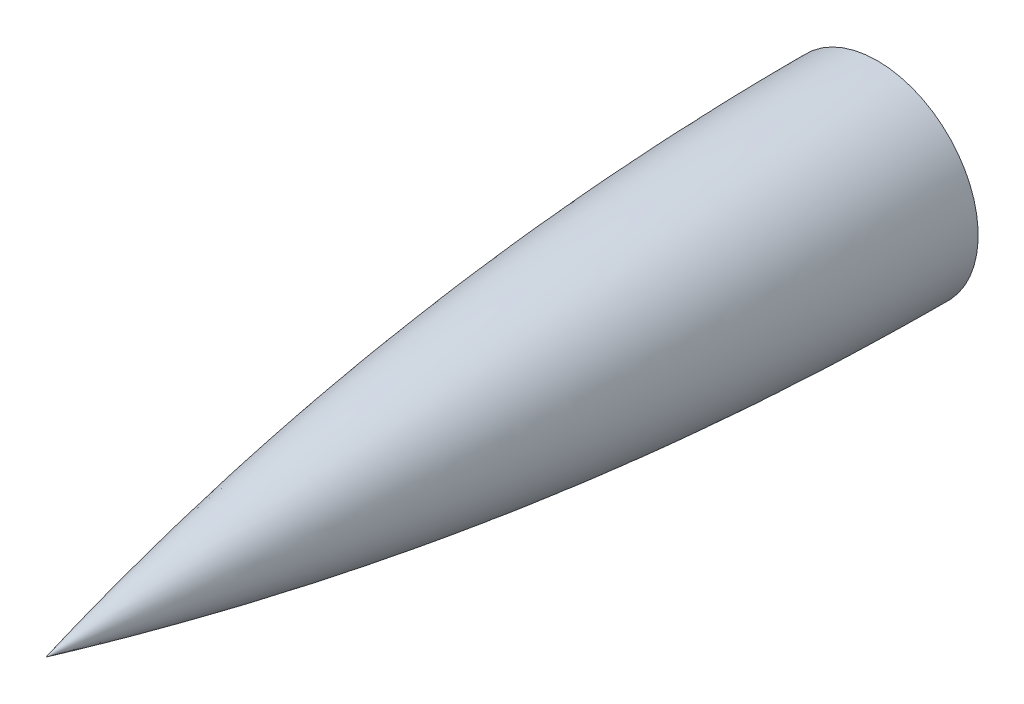
ISO-10303-21;
HEADER;
FILE_DESCRIPTION(('STEP AP214'),'2;1');
FILE_NAME('part.step','',(''),(''),'','','');
FILE_SCHEMA(('AUTOMOTIVE_DESIGN { 1 0 10303 214 1 1 1 1 }'));
ENDSEC;
DATA;
#1=APPLICATION_CONTEXT('core data for automotive mechanical design processes');
#2=APPLICATION_PROTOCOL_DEFINITION('international standard','automotive_design',2000,#1);
#3=PRODUCT_CONTEXT('',#1,'mechanical');
#4=PRODUCT('Part','Part','',(#3));
#5=PRODUCT_RELATED_PRODUCT_CATEGORY('part','',(#4));
#6=PRODUCT_DEFINITION_FORMATION('','',#4);
#7=PRODUCT_DEFINITION_CONTEXT('part definition',#1,'design');
#8=PRODUCT_DEFINITION('design','',#6,#7);
#9=PRODUCT_DEFINITION_SHAPE('','',#8);
#10=(LENGTH_UNIT() NAMED_UNIT(*) SI_UNIT(.MILLI.,.METRE.));
#11=(NAMED_UNIT(*) PLANE_ANGLE_UNIT() SI_UNIT($,.RADIAN.));
#12=(NAMED_UNIT(*) SI_UNIT($,.STERADIAN.) SOLID_ANGLE_UNIT());
#13=UNCERTAINTY_MEASURE_WITH_UNIT(LENGTH_MEASURE(1.E-05),#10,'distance_accuracy_value','');
#14=(GEOMETRIC_REPRESENTATION_CONTEXT(3) GLOBAL_UNCERTAINTY_ASSIGNED_CONTEXT((#13)) GLOBAL_UNIT_ASSIGNED_CONTEXT((#10,
#11,#12)) REPRESENTATION_CONTEXT('',''));
#15=CARTESIAN_POINT('',(0.,0.,0.));
#16=DIRECTION('',(0.,0.,1.));
#17=DIRECTION('',(1.,0.,0.));
#18=AXIS2_PLACEMENT_3D('',#15,#16,#17);
#19=CARTESIAN_POINT('',(0.,50.8000000000001,1.54988212495967E-13));
#20=CARTESIAN_POINT('',(0.,50.8,0.601365079538687));
#21=CARTESIAN_POINT('',(0.,50.7992106330532,1.81106682851214));
#22=CARTESIAN_POINT('',(0.,50.7956584817818,4.37340735369316));
#23=CARTESIAN_POINT('',(0.,50.7861860911781,7.23522524602849));
#24=CARTESIAN_POINT('',(0.,50.7719775372407,10.0726643367937));
#25=CARTESIAN_POINT('',(0.,50.7530328583311,12.9736184929585));
#26=CARTESIAN_POINT('',(0.,50.7293521055994,15.8531744296918));
#27=CARTESIAN_POINT('',(0.,50.7009353429816,18.7349387060777));
#28=CARTESIAN_POINT('',(0.,50.6676000436085,21.6333321527213));
#29=CARTESIAN_POINT('',(0.,50.6292589644624,24.5471865764733));
#30=CARTESIAN_POINT('',(0.,50.5749068032969,28.2132600767906));
#31=CARTESIAN_POINT('',(0.,50.4995086134746,32.6314834337387));
#32=CARTESIAN_POINT('',(0.,50.397117104975,37.7857849383283));
#33=CARTESIAN_POINT('',(0.,50.2603140212614,43.6760072358545));
#34=CARTESIAN_POINT('',(0.,50.0254353847092,52.5105872058537));
#35=CARTESIAN_POINT('',(0.,49.6937159982145,62.8159784935597));
#36=CARTESIAN_POINT('',(0.,48.433623126077,95.1967155084529));
#37=CARTESIAN_POINT('',(0.,44.8505008216617,152.540374475772));
#38=CARTESIAN_POINT('',(0.,38.8064209337679,211.179717997));
#39=CARTESIAN_POINT('',(0.,30.2760125789729,269.492204423295));
#40=CARTESIAN_POINT('',(0.,23.9689121299571,305.772427952917));
#41=CARTESIAN_POINT('',(0.,21.8597489130312,317.365763284394));
#42=CARTESIAN_POINT('',(0.,20.5090869147412,324.605615587789));
#43=CARTESIAN_POINT('',(0.,19.4091155854683,330.393813965379));
#44=CARTESIAN_POINT('',(0.,18.2896987871042,336.178329207407));
#45=CARTESIAN_POINT('',(0.,17.1508785393711,341.958976598366));
#46=CARTESIAN_POINT('',(0.,15.7030574989672,349.180103041335));
#47=CARTESIAN_POINT('',(0.,13.9269416840222,357.837358664998));
#48=CARTESIAN_POINT('',(0.,12.1022837932157,366.484976280109));
#49=CARTESIAN_POINT('',(0.,10.2294089945641,375.121587963031));
#50=CARTESIAN_POINT('',(0.,8.63625505883889,382.312547992372));
#51=CARTESIAN_POINT('',(0.,7.50450249754753,387.341006826934));
#52=CARTESIAN_POINT('',(0.,6.52167169986831,391.651205530606));
#53=CARTESIAN_POINT('',(0.,5.53772293048114,395.922569003378));
#54=CARTESIAN_POINT('',(0.,4.54831818546038,400.173762608327));
#55=CARTESIAN_POINT('',(0.,3.55788802846792,404.378328377264));
#56=CARTESIAN_POINT('',(0.,2.63137210748582,408.262170449303));
#57=CARTESIAN_POINT('',(0.,1.96401290205421,411.037356498978));
#58=CARTESIAN_POINT('',(0.,1.46234476068882,413.113503119476));
#59=CARTESIAN_POINT('',(0.,0.938981599428544,415.26791497626));
#60=CARTESIAN_POINT('',(0.,0.431955686333463,417.341057947048));
#61=CARTESIAN_POINT('',(0.,0.143674558299537,418.516049995998));
#62=CARTESIAN_POINT('',(0.,0.,419.099999999995));
#63=B_SPLINE_CURVE_WITH_KNOTS('',4,(#19,#20,#21,#22,#23,#24,#25,#26,#27,#28,#29,#30,#31,#32,#33,
#34,#35,#36,#37,#38,#39,#40,#41,#42,#43,#44,#45,#46,#47,#48,#49,#50,#51,#52,#53,#54,#55,#56,#57,
#58,#59,#60,#61,#62),.UNSPECIFIED.,.F.,.F.,(5,1,1,1,1,1,1,1,1,1,1,1,1,1,1,1,1,1,1,1,1,1,1,1,1,1,
1,1,1,1,1,1,1,1,1,1,1,1,1,1,5),(0.0828096401867366,0.0884937133330462,0.0941777864793557,
0.0998618596256653,0.105545932771975,0.111230005918284,0.116914079064594,0.122598152210903,
0.128282225357213,0.134091529005065,0.139900832652918,0.151519439948622,0.163138047244327,
0.174756654540031,0.186375261960833,0.221231084223238,0.24446829879279,0.430366015324999,
0.639500946166296,0.685975375193008,0.709212590399424,0.720831198002632,0.732449805605839,
0.744068413449791,0.755687021293743,0.767305629137695,0.778924236981646,0.802161449526734,
0.825398662071821,0.837017270469686,0.848635878867551,0.860254487265416,0.866063791464348,
0.871873095663281,0.883241242379984,0.894609389096688,0.900293462455039,0.903135499134215,
0.905977535813391,0.911661609171742,0.917345682530094),.UNSPECIFIED.);
#64=CARTESIAN_POINT('',(0.,0.,0.));
#65=DIRECTION('',(0.,0.,-1.));
#66=AXIS1_PLACEMENT('',#64,#65);
#67=SURFACE_OF_REVOLUTION('',#63,#66);
#68=CARTESIAN_POINT('',(0.,0.,419.099999999995));
#69=VERTEX_POINT('',#68);
#70=VERTEX_LOOP('',#69);
#71=FACE_BOUND('',#70,.T.);
#72=CARTESIAN_POINT('',(0.,0.,-4.93250221811684E-12));
#73=DIRECTION('',(0.,0.,-1.));
#74=DIRECTION('',(0.,1.,0.));
#75=AXIS2_PLACEMENT_3D('',#72,#73,#74);
#76=CIRCLE('',#75,50.8000000000001);
#77=CARTESIAN_POINT('',(0.,50.8000000000001,-4.94049245958195E-12));
#78=VERTEX_POINT('',#77);
#79=EDGE_CURVE('E11',#78,#78,#76,.T.);
#80=ORIENTED_EDGE('',*,*,#79,.F.);
#81=EDGE_LOOP('',(#80));
#82=FACE_BOUND('',#81,.T.);
#83=ADVANCED_FACE('F40',(#71,#82),#67,.F.);
#84=CARTESIAN_POINT('',(0.,50.8000000000001,-2.47424135052353E-12));
#85=DIRECTION('',(0.,0.,-1.));
#86=DIRECTION('',(0.,1.,0.));
#87=AXIS2_PLACEMENT_3D('',#84,#85,#86);
#88=PLANE('',#87);
#89=ORIENTED_EDGE('',*,*,#79,.T.);
#90=EDGE_LOOP('',(#89));
#91=FACE_BOUND('',#90,.T.);
#92=ADVANCED_FACE('F50',(#91),#88,.T.);
#93=CLOSED_SHELL('',(#83,#92));
#94=MANIFOLD_SOLID_BREP('B2',#93);
#95=ADVANCED_BREP_SHAPE_REPRESENTATION('',(#18,#94),#14);
#96=SHAPE_DEFINITION_REPRESENTATION(#9,#95);
ENDSEC;
END-ISO-10303-21;
